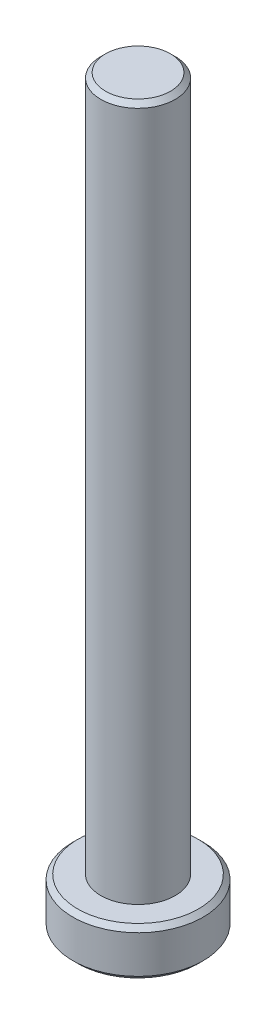
ISO-10303-21;
HEADER;
FILE_DESCRIPTION(('STEP AP214'),'2;1');
FILE_NAME('part.step','',(''),(''),'','','');
FILE_SCHEMA(('AUTOMOTIVE_DESIGN { 1 0 10303 214 1 1 1 1 }'));
ENDSEC;
DATA;
#1=APPLICATION_CONTEXT('core data for automotive mechanical design processes');
#2=APPLICATION_PROTOCOL_DEFINITION('international standard','automotive_design',2000,#1);
#3=PRODUCT_CONTEXT('',#1,'mechanical');
#4=PRODUCT('Part','Part','',(#3));
#5=PRODUCT_RELATED_PRODUCT_CATEGORY('part','',(#4));
#6=PRODUCT_DEFINITION_FORMATION('','',#4);
#7=PRODUCT_DEFINITION_CONTEXT('part definition',#1,'design');
#8=PRODUCT_DEFINITION('design','',#6,#7);
#9=PRODUCT_DEFINITION_SHAPE('','',#8);
#10=(LENGTH_UNIT() NAMED_UNIT(*) SI_UNIT(.MILLI.,.METRE.));
#11=(NAMED_UNIT(*) PLANE_ANGLE_UNIT() SI_UNIT($,.RADIAN.));
#12=(NAMED_UNIT(*) SI_UNIT($,.STERADIAN.) SOLID_ANGLE_UNIT());
#13=UNCERTAINTY_MEASURE_WITH_UNIT(LENGTH_MEASURE(1.E-05),#10,'distance_accuracy_value','');
#14=(GEOMETRIC_REPRESENTATION_CONTEXT(3) GLOBAL_UNCERTAINTY_ASSIGNED_CONTEXT((#13)) GLOBAL_UNIT_ASSIGNED_CONTEXT((#10,
#11,#12)) REPRESENTATION_CONTEXT('',''));
#15=CARTESIAN_POINT('',(0.,0.,0.));
#16=DIRECTION('',(0.,0.,1.));
#17=DIRECTION('',(1.,0.,0.));
#18=AXIS2_PLACEMENT_3D('',#15,#16,#17);
#19=CARTESIAN_POINT('',(0.,37.338,0.));
#20=DIRECTION('',(0.,-1.,0.));
#21=DIRECTION('',(0.,0.,-1.));
#22=AXIS2_PLACEMENT_3D('',#19,#20,#21);
#23=CYLINDRICAL_SURFACE('',#22,2.);
#24=CARTESIAN_POINT('',(0.,37.084,0.));
#25=DIRECTION('',(0.,1.,0.));
#26=DIRECTION('',(0.,0.,1.));
#27=AXIS2_PLACEMENT_3D('',#24,#25,#26);
#28=CIRCLE('',#27,2.);
#29=CARTESIAN_POINT('',(0.,37.084,2.));
#30=VERTEX_POINT('',#29);
#31=EDGE_CURVE('E61',#30,#30,#28,.F.);
#32=ORIENTED_EDGE('',*,*,#31,.T.);
#33=EDGE_LOOP('',(#32));
#34=FACE_BOUND('',#33,.T.);
#35=CARTESIAN_POINT('',(0.,0.,0.));
#36=DIRECTION('',(0.,1.,0.));
#37=DIRECTION('',(0.,0.,1.));
#38=AXIS2_PLACEMENT_3D('',#35,#36,#37);
#39=CIRCLE('',#38,2.);
#40=CARTESIAN_POINT('',(0.,0.,2.));
#41=VERTEX_POINT('',#40);
#42=EDGE_CURVE('E81',#41,#41,#39,.T.);
#43=ORIENTED_EDGE('',*,*,#42,.T.);
#44=EDGE_LOOP('',(#43));
#45=FACE_BOUND('',#44,.T.);
#46=ADVANCED_FACE('F46',(#34,#45),#23,.T.);
#47=CARTESIAN_POINT('',(0.,37.338,0.));
#48=DIRECTION('',(0.,1.,0.));
#49=DIRECTION('',(0.,0.,1.));
#50=AXIS2_PLACEMENT_3D('',#47,#48,#49);
#51=PLANE('',#50);
#52=CARTESIAN_POINT('',(0.,37.338,0.));
#53=DIRECTION('',(0.,1.,0.));
#54=DIRECTION('',(0.,0.,1.));
#55=AXIS2_PLACEMENT_3D('',#52,#53,#54);
#56=CIRCLE('',#55,1.74600000000001);
#57=CARTESIAN_POINT('',(0.,37.338,1.74600000000001));
#58=VERTEX_POINT('',#57);
#59=EDGE_CURVE('E67',#58,#58,#56,.T.);
#60=ORIENTED_EDGE('',*,*,#59,.T.);
#61=EDGE_LOOP('',(#60));
#62=FACE_BOUND('',#61,.T.);
#63=ADVANCED_FACE('F107',(#62),#51,.T.);
#64=CARTESIAN_POINT('',(0.,-2.54,0.));
#65=DIRECTION('',(0.,1.,0.));
#66=DIRECTION('',(0.,0.,1.));
#67=AXIS2_PLACEMENT_3D('',#64,#65,#66);
#68=CYLINDRICAL_SURFACE('',#67,3.5);
#69=CARTESIAN_POINT('',(0.,-0.253999999999999,0.));
#70=DIRECTION('',(0.,-1.,0.));
#71=DIRECTION('',(0.,0.,-1.));
#72=AXIS2_PLACEMENT_3D('',#69,#70,#71);
#73=CIRCLE('',#72,3.5);
#74=CARTESIAN_POINT('',(0.,-0.253999999999999,-3.5));
#75=VERTEX_POINT('',#74);
#76=EDGE_CURVE('E55',#75,#75,#73,.T.);
#77=ORIENTED_EDGE('',*,*,#76,.T.);
#78=EDGE_LOOP('',(#77));
#79=FACE_BOUND('',#78,.T.);
#80=CARTESIAN_POINT('',(0.,-2.286,0.));
#81=DIRECTION('',(0.,-1.,0.));
#82=DIRECTION('',(0.,0.,-1.));
#83=AXIS2_PLACEMENT_3D('',#80,#81,#82);
#84=CIRCLE('',#83,3.5);
#85=CARTESIAN_POINT('',(0.,-2.286,-3.5));
#86=VERTEX_POINT('',#85);
#87=EDGE_CURVE('E73',#86,#86,#84,.F.);
#88=ORIENTED_EDGE('',*,*,#87,.T.);
#89=EDGE_LOOP('',(#88));
#90=FACE_BOUND('',#89,.T.);
#91=ADVANCED_FACE('F102',(#79,#90),#68,.T.);
#92=CARTESIAN_POINT('',(0.,-2.54,0.));
#93=DIRECTION('',(0.,-1.,0.));
#94=DIRECTION('',(0.,0.,-1.));
#95=AXIS2_PLACEMENT_3D('',#92,#93,#94);
#96=PLANE('',#95);
#97=CARTESIAN_POINT('',(0.,-2.54,0.));
#98=DIRECTION('',(0.,-1.,0.));
#99=DIRECTION('',(0.,0.,-1.));
#100=AXIS2_PLACEMENT_3D('',#97,#98,#99);
#101=CIRCLE('',#100,3.246);
#102=CARTESIAN_POINT('',(0.,-2.54,-3.246));
#103=VERTEX_POINT('',#102);
#104=EDGE_CURVE('E77',#103,#103,#101,.T.);
#105=ORIENTED_EDGE('',*,*,#104,.T.);
#106=EDGE_LOOP('',(#105));
#107=FACE_BOUND('',#106,.T.);
#108=ADVANCED_FACE('F91',(#107),#96,.T.);
#109=CARTESIAN_POINT('',(0.,0.,0.));
#110=DIRECTION('',(0.,-1.,0.));
#111=DIRECTION('',(0.,0.,-1.));
#112=AXIS2_PLACEMENT_3D('',#109,#110,#111);
#113=PLANE('',#112);
#114=CARTESIAN_POINT('',(0.,0.,0.));
#115=DIRECTION('',(0.,-1.,0.));
#116=DIRECTION('',(0.,0.,-1.));
#117=AXIS2_PLACEMENT_3D('',#114,#115,#116);
#118=CIRCLE('',#117,3.246);
#119=CARTESIAN_POINT('',(0.,0.,-3.246));
#120=VERTEX_POINT('',#119);
#121=EDGE_CURVE('E10',#120,#120,#118,.F.);
#122=ORIENTED_EDGE('',*,*,#121,.T.);
#123=EDGE_LOOP('',(#122));
#124=FACE_BOUND('',#123,.T.);
#125=ORIENTED_EDGE('',*,*,#42,.F.);
#126=EDGE_LOOP('',(#125));
#127=FACE_BOUND('',#126,.T.);
#128=ADVANCED_FACE('F88',(#124,#127),#113,.F.);
#129=CARTESIAN_POINT('',(0.,-2.54,0.));
#130=DIRECTION('',(0.,1.,0.));
#131=DIRECTION('',(0.,0.,1.));
#132=AXIS2_PLACEMENT_3D('',#129,#130,#131);
#133=CONICAL_SURFACE('',#132,3.246,0.785398163397443);
#134=ORIENTED_EDGE('',*,*,#87,.F.);
#135=EDGE_LOOP('',(#134));
#136=FACE_BOUND('',#135,.T.);
#137=ORIENTED_EDGE('',*,*,#104,.F.);
#138=EDGE_LOOP('',(#137));
#139=FACE_BOUND('',#138,.T.);
#140=ADVANCED_FACE('F90',(#136,#139),#133,.T.);
#141=CARTESIAN_POINT('',(0.,37.338,0.));
#142=DIRECTION('',(0.,-1.,0.));
#143=DIRECTION('',(0.,0.,-1.));
#144=AXIS2_PLACEMENT_3D('',#141,#142,#143);
#145=CONICAL_SURFACE('',#144,1.74600000000001,0.785398163397431);
#146=ORIENTED_EDGE('',*,*,#31,.F.);
#147=EDGE_LOOP('',(#146));
#148=FACE_BOUND('',#147,.T.);
#149=ORIENTED_EDGE('',*,*,#59,.F.);
#150=EDGE_LOOP('',(#149));
#151=FACE_BOUND('',#150,.T.);
#152=ADVANCED_FACE('F98',(#148,#151),#145,.T.);
#153=CARTESIAN_POINT('',(0.,-0.253999999999999,0.));
#154=DIRECTION('',(0.,-1.,0.));
#155=DIRECTION('',(0.,0.,-1.));
#156=AXIS2_PLACEMENT_3D('',#153,#154,#155);
#157=CONICAL_SURFACE('',#156,3.5,0.785398163397452);
#158=ORIENTED_EDGE('',*,*,#121,.F.);
#159=EDGE_LOOP('',(#158));
#160=FACE_BOUND('',#159,.T.);
#161=ORIENTED_EDGE('',*,*,#76,.F.);
#162=EDGE_LOOP('',(#161));
#163=FACE_BOUND('',#162,.T.);
#164=ADVANCED_FACE('F49',(#160,#163),#157,.T.);
#165=CLOSED_SHELL('',(#46,#63,#91,#108,#128,#140,#152,#164));
#166=MANIFOLD_SOLID_BREP('B2',#165);
#167=ADVANCED_BREP_SHAPE_REPRESENTATION('',(#18,#166),#14);
#168=SHAPE_DEFINITION_REPRESENTATION(#9,#167);
ENDSEC;
END-ISO-10303-21;
